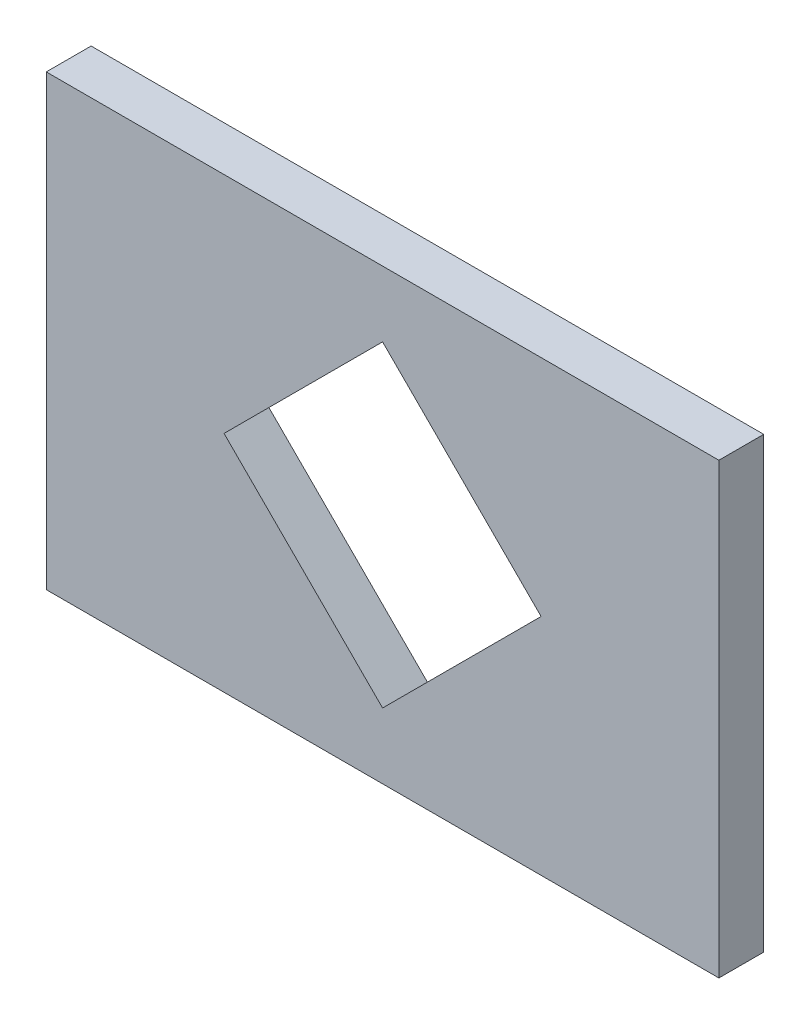
ISO-10303-21;
HEADER;
FILE_DESCRIPTION(('STEP AP214'),'2;1');
FILE_NAME('part.step','',(''),(''),'','','');
FILE_SCHEMA(('AUTOMOTIVE_DESIGN { 1 0 10303 214 1 1 1 1 }'));
ENDSEC;
DATA;
#1=APPLICATION_CONTEXT('core data for automotive mechanical design processes');
#2=APPLICATION_PROTOCOL_DEFINITION('international standard','automotive_design',2000,#1);
#3=PRODUCT_CONTEXT('',#1,'mechanical');
#4=PRODUCT('Part','Part','',(#3));
#5=PRODUCT_RELATED_PRODUCT_CATEGORY('part','',(#4));
#6=PRODUCT_DEFINITION_FORMATION('','',#4);
#7=PRODUCT_DEFINITION_CONTEXT('part definition',#1,'design');
#8=PRODUCT_DEFINITION('design','',#6,#7);
#9=PRODUCT_DEFINITION_SHAPE('','',#8);
#10=(LENGTH_UNIT() NAMED_UNIT(*) SI_UNIT(.MILLI.,.METRE.));
#11=(NAMED_UNIT(*) PLANE_ANGLE_UNIT() SI_UNIT($,.RADIAN.));
#12=(NAMED_UNIT(*) SI_UNIT($,.STERADIAN.) SOLID_ANGLE_UNIT());
#13=UNCERTAINTY_MEASURE_WITH_UNIT(LENGTH_MEASURE(1.E-05),#10,'distance_accuracy_value','');
#14=(GEOMETRIC_REPRESENTATION_CONTEXT(3) GLOBAL_UNCERTAINTY_ASSIGNED_CONTEXT((#13)) GLOBAL_UNIT_ASSIGNED_CONTEXT((#10,
#11,#12)) REPRESENTATION_CONTEXT('',''));
#15=CARTESIAN_POINT('',(0.,0.,0.));
#16=DIRECTION('',(0.,0.,1.));
#17=DIRECTION('',(1.,0.,0.));
#18=AXIS2_PLACEMENT_3D('',#15,#16,#17);
#19=CARTESIAN_POINT('',(0.,0.,10.));
#20=DIRECTION('',(0.,0.,1.));
#21=DIRECTION('',(1.,0.,0.));
#22=AXIS2_PLACEMENT_3D('',#19,#20,#21);
#23=PLANE('',#22);
#24=DIRECTION('',(0.,1.,0.));
#25=VECTOR('',#24,1.);
#26=CARTESIAN_POINT('',(75.,50.,10.));
#27=LINE('',#26,#25);
#28=CARTESIAN_POINT('',(75.,-50.,10.));
#29=VERTEX_POINT('',#28);
#30=CARTESIAN_POINT('',(75.,50.,10.));
#31=VERTEX_POINT('',#30);
#32=EDGE_CURVE('E157',#29,#31,#27,.T.);
#33=ORIENTED_EDGE('',*,*,#32,.T.);
#34=DIRECTION('',(-1.,0.,0.));
#35=VECTOR('',#34,1.);
#36=CARTESIAN_POINT('',(-75.,50.,10.));
#37=LINE('',#36,#35);
#38=CARTESIAN_POINT('',(-75.,50.,10.));
#39=VERTEX_POINT('',#38);
#40=EDGE_CURVE('E161',#31,#39,#37,.T.);
#41=ORIENTED_EDGE('',*,*,#40,.T.);
#42=DIRECTION('',(0.,-1.,0.));
#43=VECTOR('',#42,1.);
#44=CARTESIAN_POINT('',(-75.,50.,10.));
#45=LINE('',#44,#43);
#46=CARTESIAN_POINT('',(-75.,-50.,10.));
#47=VERTEX_POINT('',#46);
#48=EDGE_CURVE('E165',#39,#47,#45,.T.);
#49=ORIENTED_EDGE('',*,*,#48,.T.);
#50=DIRECTION('',(1.,0.,0.));
#51=VECTOR('',#50,1.);
#52=CARTESIAN_POINT('',(-75.,-50.,10.));
#53=LINE('',#52,#51);
#54=EDGE_CURVE('E168',#47,#29,#53,.T.);
#55=ORIENTED_EDGE('',*,*,#54,.T.);
#56=EDGE_LOOP('',(#33,#41,#49,#55));
#57=FACE_BOUND('',#56,.T.);
#58=DIRECTION('',(0.707106781186547,0.707106781186548,0.));
#59=VECTOR('',#58,1.);
#60=CARTESIAN_POINT('',(0.,-35.3553390593274,10.));
#61=LINE('',#60,#59);
#62=CARTESIAN_POINT('',(0.,-35.3553390593274,10.));
#63=VERTEX_POINT('',#62);
#64=CARTESIAN_POINT('',(35.3553390593273,0.,10.));
#65=VERTEX_POINT('',#64);
#66=EDGE_CURVE('E118',#63,#65,#61,.T.);
#67=ORIENTED_EDGE('',*,*,#66,.F.);
#68=DIRECTION('',(0.707106781186547,-0.707106781186547,0.));
#69=VECTOR('',#68,1.);
#70=CARTESIAN_POINT('',(-35.3553390593274,0.,10.));
#71=LINE('',#70,#69);
#72=CARTESIAN_POINT('',(-35.3553390593274,0.,10.));
#73=VERTEX_POINT('',#72);
#74=EDGE_CURVE('E109',#73,#63,#71,.T.);
#75=ORIENTED_EDGE('',*,*,#74,.F.);
#76=DIRECTION('',(-0.707106781186547,-0.707106781186547,0.));
#77=VECTOR('',#76,1.);
#78=CARTESIAN_POINT('',(0.,35.3553390593274,10.));
#79=LINE('',#78,#77);
#80=CARTESIAN_POINT('',(0.,35.3553390593274,10.));
#81=VERTEX_POINT('',#80);
#82=EDGE_CURVE('E135',#81,#73,#79,.T.);
#83=ORIENTED_EDGE('',*,*,#82,.F.);
#84=DIRECTION('',(-0.707106781186548,0.707106781186547,0.));
#85=VECTOR('',#84,1.);
#86=CARTESIAN_POINT('',(35.3553390593273,0.,10.));
#87=LINE('',#86,#85);
#88=EDGE_CURVE('E131',#65,#81,#87,.T.);
#89=ORIENTED_EDGE('',*,*,#88,.F.);
#90=EDGE_LOOP('',(#67,#75,#83,#89));
#91=FACE_BOUND('',#90,.T.);
#92=ADVANCED_FACE('F43',(#57,#91),#23,.T.);
#93=CARTESIAN_POINT('',(0.,0.,0.));
#94=DIRECTION('',(0.,0.,1.));
#95=DIRECTION('',(1.,0.,0.));
#96=AXIS2_PLACEMENT_3D('',#93,#94,#95);
#97=PLANE('',#96);
#98=DIRECTION('',(0.,1.,0.));
#99=VECTOR('',#98,1.);
#100=CARTESIAN_POINT('',(75.,50.,0.));
#101=LINE('',#100,#99);
#102=CARTESIAN_POINT('',(75.,-50.,0.));
#103=VERTEX_POINT('',#102);
#104=CARTESIAN_POINT('',(75.,50.,0.));
#105=VERTEX_POINT('',#104);
#106=EDGE_CURVE('E127',#103,#105,#101,.T.);
#107=ORIENTED_EDGE('',*,*,#106,.F.);
#108=DIRECTION('',(1.,0.,0.));
#109=VECTOR('',#108,1.);
#110=CARTESIAN_POINT('',(-75.,-50.,0.));
#111=LINE('',#110,#109);
#112=CARTESIAN_POINT('',(-75.,-50.,0.));
#113=VERTEX_POINT('',#112);
#114=EDGE_CURVE('E162',#113,#103,#111,.T.);
#115=ORIENTED_EDGE('',*,*,#114,.F.);
#116=DIRECTION('',(0.,-1.,0.));
#117=VECTOR('',#116,1.);
#118=CARTESIAN_POINT('',(-75.,50.,0.));
#119=LINE('',#118,#117);
#120=CARTESIAN_POINT('',(-75.,50.,0.));
#121=VERTEX_POINT('',#120);
#122=EDGE_CURVE('E178',#121,#113,#119,.T.);
#123=ORIENTED_EDGE('',*,*,#122,.F.);
#124=DIRECTION('',(-1.,0.,0.));
#125=VECTOR('',#124,1.);
#126=CARTESIAN_POINT('',(-75.,50.,0.));
#127=LINE('',#126,#125);
#128=EDGE_CURVE('E175',#105,#121,#127,.T.);
#129=ORIENTED_EDGE('',*,*,#128,.F.);
#130=EDGE_LOOP('',(#107,#115,#123,#129));
#131=FACE_BOUND('',#130,.T.);
#132=DIRECTION('',(0.707106781186547,-0.707106781186547,0.));
#133=VECTOR('',#132,1.);
#134=CARTESIAN_POINT('',(-35.3553390593274,0.,0.));
#135=LINE('',#134,#133);
#136=CARTESIAN_POINT('',(-35.3553390593274,0.,0.));
#137=VERTEX_POINT('',#136);
#138=CARTESIAN_POINT('',(0.,-35.3553390593274,0.));
#139=VERTEX_POINT('',#138);
#140=EDGE_CURVE('E67',#137,#139,#135,.T.);
#141=ORIENTED_EDGE('',*,*,#140,.T.);
#142=DIRECTION('',(0.707106781186547,0.707106781186548,0.));
#143=VECTOR('',#142,1.);
#144=CARTESIAN_POINT('',(0.,-35.3553390593274,0.));
#145=LINE('',#144,#143);
#146=CARTESIAN_POINT('',(35.3553390593273,0.,0.));
#147=VERTEX_POINT('',#146);
#148=EDGE_CURVE('E125',#139,#147,#145,.T.);
#149=ORIENTED_EDGE('',*,*,#148,.T.);
#150=DIRECTION('',(-0.707106781186548,0.707106781186547,0.));
#151=VECTOR('',#150,1.);
#152=CARTESIAN_POINT('',(35.3553390593273,0.,0.));
#153=LINE('',#152,#151);
#154=CARTESIAN_POINT('',(0.,35.3553390593274,0.));
#155=VERTEX_POINT('',#154);
#156=EDGE_CURVE('E144',#147,#155,#153,.T.);
#157=ORIENTED_EDGE('',*,*,#156,.T.);
#158=DIRECTION('',(-0.707106781186547,-0.707106781186547,0.));
#159=VECTOR('',#158,1.);
#160=CARTESIAN_POINT('',(0.,35.3553390593274,0.));
#161=LINE('',#160,#159);
#162=EDGE_CURVE('E119',#155,#137,#161,.T.);
#163=ORIENTED_EDGE('',*,*,#162,.T.);
#164=EDGE_LOOP('',(#141,#149,#157,#163));
#165=FACE_BOUND('',#164,.T.);
#166=ADVANCED_FACE('F201',(#131,#165),#97,.F.);
#167=CARTESIAN_POINT('',(75.,50.,10.));
#168=DIRECTION('',(-1.,0.,0.));
#169=DIRECTION('',(0.,0.,1.));
#170=AXIS2_PLACEMENT_3D('',#167,#168,#169);
#171=PLANE('',#170);
#172=ORIENTED_EDGE('',*,*,#106,.T.);
#173=DIRECTION('',(0.,0.,-1.));
#174=VECTOR('',#173,1.);
#175=CARTESIAN_POINT('',(75.,50.,10.));
#176=LINE('',#175,#174);
#177=EDGE_CURVE('E11',#31,#105,#176,.T.);
#178=ORIENTED_EDGE('',*,*,#177,.F.);
#179=ORIENTED_EDGE('',*,*,#32,.F.);
#180=DIRECTION('',(0.,0.,-1.));
#181=VECTOR('',#180,1.);
#182=CARTESIAN_POINT('',(75.,-50.,10.));
#183=LINE('',#182,#181);
#184=EDGE_CURVE('E171',#29,#103,#183,.T.);
#185=ORIENTED_EDGE('',*,*,#184,.T.);
#186=EDGE_LOOP('',(#172,#178,#179,#185));
#187=FACE_BOUND('',#186,.T.);
#188=ADVANCED_FACE('F45',(#187),#171,.F.);
#189=CARTESIAN_POINT('',(-75.,50.,10.));
#190=DIRECTION('',(0.,-1.,0.));
#191=DIRECTION('',(0.,0.,-1.));
#192=AXIS2_PLACEMENT_3D('',#189,#190,#191);
#193=PLANE('',#192);
#194=ORIENTED_EDGE('',*,*,#128,.T.);
#195=DIRECTION('',(0.,0.,-1.));
#196=VECTOR('',#195,1.);
#197=CARTESIAN_POINT('',(-75.,50.,10.));
#198=LINE('',#197,#196);
#199=EDGE_CURVE('E52',#39,#121,#198,.T.);
#200=ORIENTED_EDGE('',*,*,#199,.F.);
#201=ORIENTED_EDGE('',*,*,#40,.F.);
#202=ORIENTED_EDGE('',*,*,#177,.T.);
#203=EDGE_LOOP('',(#194,#200,#201,#202));
#204=FACE_BOUND('',#203,.T.);
#205=ADVANCED_FACE('F211',(#204),#193,.F.);
#206=CARTESIAN_POINT('',(-75.,50.,10.));
#207=DIRECTION('',(1.,0.,0.));
#208=DIRECTION('',(0.,0.,-1.));
#209=AXIS2_PLACEMENT_3D('',#206,#207,#208);
#210=PLANE('',#209);
#211=ORIENTED_EDGE('',*,*,#122,.T.);
#212=DIRECTION('',(0.,0.,-1.));
#213=VECTOR('',#212,1.);
#214=CARTESIAN_POINT('',(-75.,-50.,10.));
#215=LINE('',#214,#213);
#216=EDGE_CURVE('E186',#47,#113,#215,.T.);
#217=ORIENTED_EDGE('',*,*,#216,.F.);
#218=ORIENTED_EDGE('',*,*,#48,.F.);
#219=ORIENTED_EDGE('',*,*,#199,.T.);
#220=EDGE_LOOP('',(#211,#217,#218,#219));
#221=FACE_BOUND('',#220,.T.);
#222=ADVANCED_FACE('F195',(#221),#210,.F.);
#223=CARTESIAN_POINT('',(-75.,-50.,10.));
#224=DIRECTION('',(0.,1.,0.));
#225=DIRECTION('',(0.,0.,1.));
#226=AXIS2_PLACEMENT_3D('',#223,#224,#225);
#227=PLANE('',#226);
#228=ORIENTED_EDGE('',*,*,#114,.T.);
#229=ORIENTED_EDGE('',*,*,#184,.F.);
#230=ORIENTED_EDGE('',*,*,#54,.F.);
#231=ORIENTED_EDGE('',*,*,#216,.T.);
#232=EDGE_LOOP('',(#228,#229,#230,#231));
#233=FACE_BOUND('',#232,.T.);
#234=ADVANCED_FACE('F205',(#233),#227,.F.);
#235=CARTESIAN_POINT('',(-35.3553390593274,0.,10.));
#236=DIRECTION('',(0.707106781186547,0.707106781186548,0.));
#237=DIRECTION('',(-0.707106781186548,0.707106781186547,0.));
#238=AXIS2_PLACEMENT_3D('',#235,#236,#237);
#239=PLANE('',#238);
#240=ORIENTED_EDGE('',*,*,#140,.F.);
#241=DIRECTION('',(0.,0.,-1.));
#242=VECTOR('',#241,1.);
#243=CARTESIAN_POINT('',(-35.3553390593274,0.,10.));
#244=LINE('',#243,#242);
#245=EDGE_CURVE('E113',#73,#137,#244,.T.);
#246=ORIENTED_EDGE('',*,*,#245,.F.);
#247=ORIENTED_EDGE('',*,*,#74,.T.);
#248=DIRECTION('',(0.,0.,-1.));
#249=VECTOR('',#248,1.);
#250=CARTESIAN_POINT('',(0.,-35.3553390593274,10.));
#251=LINE('',#250,#249);
#252=EDGE_CURVE('E112',#63,#139,#251,.T.);
#253=ORIENTED_EDGE('',*,*,#252,.T.);
#254=EDGE_LOOP('',(#240,#246,#247,#253));
#255=FACE_BOUND('',#254,.T.);
#256=ADVANCED_FACE('F111',(#255),#239,.T.);
#257=CARTESIAN_POINT('',(0.,-35.3553390593274,10.));
#258=DIRECTION('',(-0.707106781186548,0.707106781186547,0.));
#259=DIRECTION('',(-0.707106781186547,-0.707106781186548,0.));
#260=AXIS2_PLACEMENT_3D('',#257,#258,#259);
#261=PLANE('',#260);
#262=ORIENTED_EDGE('',*,*,#148,.F.);
#263=ORIENTED_EDGE('',*,*,#252,.F.);
#264=ORIENTED_EDGE('',*,*,#66,.T.);
#265=DIRECTION('',(0.,0.,-1.));
#266=VECTOR('',#265,1.);
#267=CARTESIAN_POINT('',(35.3553390593273,0.,10.));
#268=LINE('',#267,#266);
#269=EDGE_CURVE('E128',#65,#147,#268,.T.);
#270=ORIENTED_EDGE('',*,*,#269,.T.);
#271=EDGE_LOOP('',(#262,#263,#264,#270));
#272=FACE_BOUND('',#271,.T.);
#273=ADVANCED_FACE('F122',(#272),#261,.T.);
#274=CARTESIAN_POINT('',(35.3553390593273,0.,10.));
#275=DIRECTION('',(-0.707106781186547,-0.707106781186548,0.));
#276=DIRECTION('',(0.707106781186548,-0.707106781186547,0.));
#277=AXIS2_PLACEMENT_3D('',#274,#275,#276);
#278=PLANE('',#277);
#279=ORIENTED_EDGE('',*,*,#156,.F.);
#280=ORIENTED_EDGE('',*,*,#269,.F.);
#281=ORIENTED_EDGE('',*,*,#88,.T.);
#282=DIRECTION('',(0.,0.,-1.));
#283=VECTOR('',#282,1.);
#284=CARTESIAN_POINT('',(0.,35.3553390593274,10.));
#285=LINE('',#284,#283);
#286=EDGE_CURVE('E59',#81,#155,#285,.T.);
#287=ORIENTED_EDGE('',*,*,#286,.T.);
#288=EDGE_LOOP('',(#279,#280,#281,#287));
#289=FACE_BOUND('',#288,.T.);
#290=ADVANCED_FACE('F234',(#289),#278,.T.);
#291=CARTESIAN_POINT('',(0.,35.3553390593274,10.));
#292=DIRECTION('',(0.707106781186548,-0.707106781186548,0.));
#293=DIRECTION('',(0.707106781186548,0.707106781186548,0.));
#294=AXIS2_PLACEMENT_3D('',#291,#292,#293);
#295=PLANE('',#294);
#296=ORIENTED_EDGE('',*,*,#162,.F.);
#297=ORIENTED_EDGE('',*,*,#286,.F.);
#298=ORIENTED_EDGE('',*,*,#82,.T.);
#299=ORIENTED_EDGE('',*,*,#245,.T.);
#300=EDGE_LOOP('',(#296,#297,#298,#299));
#301=FACE_BOUND('',#300,.T.);
#302=ADVANCED_FACE('F238',(#301),#295,.T.);
#303=CLOSED_SHELL('',(#92,#166,#188,#205,#222,#234,#256,#273,#290,#302));
#304=MANIFOLD_SOLID_BREP('B2',#303);
#305=ADVANCED_BREP_SHAPE_REPRESENTATION('',(#18,#304),#14);
#306=SHAPE_DEFINITION_REPRESENTATION(#9,#305);
ENDSEC;
END-ISO-10303-21;
